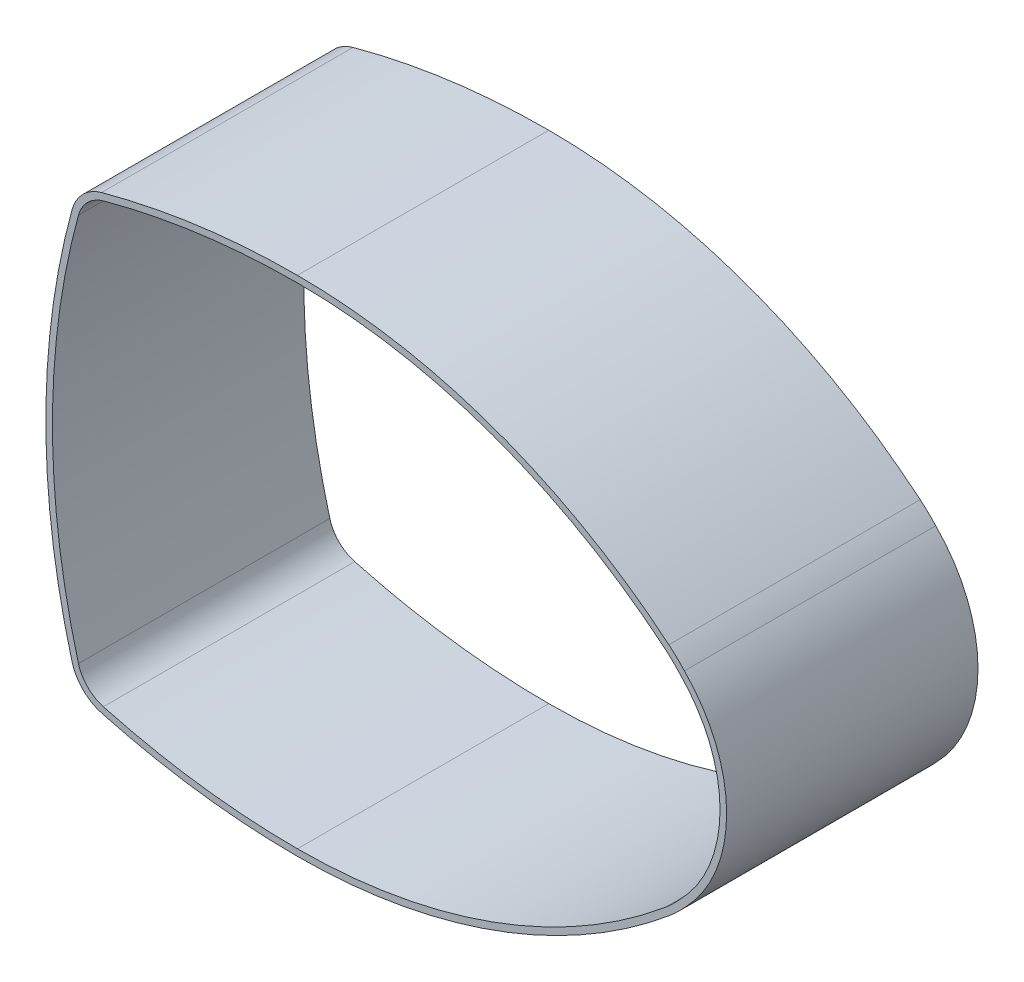
ISO-10303-21;
HEADER;
FILE_DESCRIPTION(('STEP AP214'),'2;1');
FILE_NAME('part.step','',(''),(''),'','','');
FILE_SCHEMA(('AUTOMOTIVE_DESIGN { 1 0 10303 214 1 1 1 1 }'));
ENDSEC;
DATA;
#1=APPLICATION_CONTEXT('core data for automotive mechanical design processes');
#2=APPLICATION_PROTOCOL_DEFINITION('international standard','automotive_design',2000,#1);
#3=PRODUCT_CONTEXT('',#1,'mechanical');
#4=PRODUCT('Part','Part','',(#3));
#5=PRODUCT_RELATED_PRODUCT_CATEGORY('part','',(#4));
#6=PRODUCT_DEFINITION_FORMATION('','',#4);
#7=PRODUCT_DEFINITION_CONTEXT('part definition',#1,'design');
#8=PRODUCT_DEFINITION('design','',#6,#7);
#9=PRODUCT_DEFINITION_SHAPE('','',#8);
#10=(LENGTH_UNIT() NAMED_UNIT(*) SI_UNIT(.MILLI.,.METRE.));
#11=(NAMED_UNIT(*) PLANE_ANGLE_UNIT() SI_UNIT($,.RADIAN.));
#12=(NAMED_UNIT(*) SI_UNIT($,.STERADIAN.) SOLID_ANGLE_UNIT());
#13=UNCERTAINTY_MEASURE_WITH_UNIT(LENGTH_MEASURE(1.E-05),#10,'distance_accuracy_value','');
#14=(GEOMETRIC_REPRESENTATION_CONTEXT(3) GLOBAL_UNCERTAINTY_ASSIGNED_CONTEXT((#13)) GLOBAL_UNIT_ASSIGNED_CONTEXT((#10,
#11,#12)) REPRESENTATION_CONTEXT('',''));
#15=CARTESIAN_POINT('',(0.,0.,0.));
#16=DIRECTION('',(0.,0.,1.));
#17=DIRECTION('',(1.,0.,0.));
#18=AXIS2_PLACEMENT_3D('',#15,#16,#17);
#19=CARTESIAN_POINT('',(41.6420544105904,62.4105109617289,38.1));
#20=DIRECTION('',(0.,0.,-1.));
#21=DIRECTION('',(-1.,0.,0.));
#22=AXIS2_PLACEMENT_3D('',#19,#20,#21);
#23=PLANE('',#22);
#24=CARTESIAN_POINT('',(42.3953400625025,62.410510974871,38.1));
#25=DIRECTION('',(0.,0.,1.));
#26=DIRECTION('',(-1.,0.,0.));
#27=AXIS2_PLACEMENT_3D('',#24,#25,#26);
#28=CIRCLE('',#27,22.0469690110161);
#29=CARTESIAN_POINT('',(58.0391292223879,46.8753668435537,38.1));
#30=VERTEX_POINT('',#29);
#31=CARTESIAN_POINT('',(58.0391292242888,77.9456551079096,38.1));
#32=VERTEX_POINT('',#31);
#33=EDGE_CURVE('E255',#30,#32,#28,.T.);
#34=ORIENTED_EDGE('',*,*,#33,.T.);
#35=CARTESIAN_POINT('',(40.8887687586783,62.4105109485867,38.1));
#36=DIRECTION('',(0.,0.,1.));
#37=DIRECTION('',(1.,0.,0.));
#38=AXIS2_PLACEMENT_3D('',#35,#36,#37);
#39=CIRCLE('',#38,23.140345030948);
#40=CARTESIAN_POINT('',(55.6838539146788,80.2032348372445,38.1));
#41=VERTEX_POINT('',#40);
#42=EDGE_CURVE('E258',#32,#41,#39,.T.);
#43=ORIENTED_EDGE('',*,*,#42,.T.);
#44=CARTESIAN_POINT('',(-0.611231212107009,12.5021776456092,38.1));
#45=DIRECTION('',(0.,0.,1.));
#46=DIRECTION('',(1.,0.,0.));
#47=AXIS2_PLACEMENT_3D('',#44,#45,#46);
#48=CIRCLE('',#47,88.0486783222618);
#49=CARTESIAN_POINT('',(-0.611231213972652,100.550855967871,38.1));
#50=VERTEX_POINT('',#49);
#51=EDGE_CURVE('E261',#41,#50,#48,.T.);
#52=ORIENTED_EDGE('',*,*,#51,.T.);
#53=CARTESIAN_POINT('',(-0.611231219024219,-12.2478223410265,38.1));
#54=DIRECTION('',(0.,0.,1.));
#55=DIRECTION('',(1.,0.,0.));
#56=AXIS2_PLACEMENT_3D('',#53,#54,#55);
#57=CIRCLE('',#56,112.798678308898);
#58=CARTESIAN_POINT('',(-30.2927692507265,96.5756499813855,38.1));
#59=VERTEX_POINT('',#58);
#60=EDGE_CURVE('E263',#50,#59,#57,.T.);
#61=ORIENTED_EDGE('',*,*,#60,.T.);
#62=CARTESIAN_POINT('',(-28.6112312120414,90.4105109728702,38.1));
#63=DIRECTION('',(0.,0.,1.));
#64=DIRECTION('',(1.,0.,0.));
#65=AXIS2_PLACEMENT_3D('',#62,#63,#64);
#66=CIRCLE('',#65,6.39034499615337);
#67=CARTESIAN_POINT('',(-34.7763702207224,92.0920490109478,38.1));
#68=VERTEX_POINT('',#67);
#69=EDGE_CURVE('E265',#59,#68,#66,.T.);
#70=ORIENTED_EDGE('',*,*,#69,.T.);
#71=CARTESIAN_POINT('',(74.0471021245286,62.4105109748711,38.1));
#72=DIRECTION('',(0.,0.,1.));
#73=DIRECTION('',(1.,0.,0.));
#74=AXIS2_PLACEMENT_3D('',#71,#72,#73);
#75=CIRCLE('',#74,112.798678332083);
#76=CARTESIAN_POINT('',(-34.7763702205594,32.7289729381969,38.1));
#77=VERTEX_POINT('',#76);
#78=EDGE_CURVE('E267',#68,#77,#75,.T.);
#79=ORIENTED_EDGE('',*,*,#78,.T.);
#80=CARTESIAN_POINT('',(-28.6112312120415,34.4105109768718,38.1));
#81=DIRECTION('',(0.,0.,1.));
#82=DIRECTION('',(1.,0.,0.));
#83=AXIS2_PLACEMENT_3D('',#80,#81,#82);
#84=CIRCLE('',#83,6.39034499615321);
#85=CARTESIAN_POINT('',(-30.2927692501432,28.2453719681975,38.1));
#86=VERTEX_POINT('',#85);
#87=EDGE_CURVE('E269',#77,#86,#84,.T.);
#88=ORIENTED_EDGE('',*,*,#87,.T.);
#89=CARTESIAN_POINT('',(-0.611231219025108,137.068844290764,38.1));
#90=DIRECTION('',(0.,0.,1.));
#91=DIRECTION('',(1.,0.,0.));
#92=AXIS2_PLACEMENT_3D('',#89,#90,#91);
#93=CIRCLE('',#92,112.798678308893);
#94=CARTESIAN_POINT('',(-0.611231214043513,24.2701659818711,38.1));
#95=VERTEX_POINT('',#94);
#96=EDGE_CURVE('E271',#86,#95,#93,.T.);
#97=ORIENTED_EDGE('',*,*,#96,.T.);
#98=CARTESIAN_POINT('',(-0.61123121210712,112.318844304133,38.1));
#99=DIRECTION('',(0.,0.,1.));
#100=DIRECTION('',(1.,0.,0.));
#101=AXIS2_PLACEMENT_3D('',#98,#99,#100);
#102=CIRCLE('',#101,88.0486783222617);
#103=CARTESIAN_POINT('',(55.6838539148431,44.6177871126343,38.1));
#104=VERTEX_POINT('',#103);
#105=EDGE_CURVE('E273',#95,#104,#102,.T.);
#106=ORIENTED_EDGE('',*,*,#105,.T.);
#107=CARTESIAN_POINT('',(40.8887687586783,62.4105109485867,38.1));
#108=DIRECTION('',(0.,0.,1.));
#109=DIRECTION('',(1.,0.,0.));
#110=AXIS2_PLACEMENT_3D('',#107,#108,#109);
#111=CIRCLE('',#110,23.140344993092);
#112=EDGE_CURVE('E275',#104,#30,#111,.T.);
#113=ORIENTED_EDGE('',*,*,#112,.T.);
#114=EDGE_LOOP('',(#34,#43,#52,#61,#70,#79,#88,#97,#106,#113));
#115=FACE_BOUND('',#114,.T.);
#116=CARTESIAN_POINT('',(40.8887687586783,62.4105109485867,38.1));
#117=DIRECTION('',(0.,0.,1.));
#118=DIRECTION('',(1.,0.,0.));
#119=AXIS2_PLACEMENT_3D('',#116,#117,#118);
#120=CIRCLE('',#119,22.140345030948);
#121=CARTESIAN_POINT('',(57.3133912528674,77.2572834602405,38.1));
#122=VERTEX_POINT('',#121);
#123=CARTESIAN_POINT('',(55.0444907100155,79.4343299715279,38.1));
#124=VERTEX_POINT('',#123);
#125=EDGE_CURVE('E176',#122,#124,#120,.T.);
#126=ORIENTED_EDGE('',*,*,#125,.F.);
#127=CARTESIAN_POINT('',(42.3953400625025,62.410510974871,38.1));
#128=DIRECTION('',(0.,0.,1.));
#129=DIRECTION('',(-1.,0.,0.));
#130=AXIS2_PLACEMENT_3D('',#127,#128,#129);
#131=CIRCLE('',#130,21.0469690110161);
#132=CARTESIAN_POINT('',(57.3133912528674,47.5637384895016,38.1));
#133=VERTEX_POINT('',#132);
#134=EDGE_CURVE('E213',#133,#122,#131,.T.);
#135=ORIENTED_EDGE('',*,*,#134,.F.);
#136=CARTESIAN_POINT('',(40.8887687586792,62.4105110011545,38.1));
#137=DIRECTION('',(0.,0.,1.));
#138=DIRECTION('',(1.,0.,0.));
#139=AXIS2_PLACEMENT_3D('',#136,#137,#138);
#140=CIRCLE('',#139,22.1403450309467);
#141=CARTESIAN_POINT('',(55.044490710311,45.3866919784599,38.1));
#142=VERTEX_POINT('',#141);
#143=EDGE_CURVE('E211',#142,#133,#140,.T.);
#144=ORIENTED_EDGE('',*,*,#143,.F.);
#145=CARTESIAN_POINT('',(-0.61123121210712,112.318844304133,38.1));
#146=DIRECTION('',(0.,0.,1.));
#147=DIRECTION('',(1.,0.,0.));
#148=AXIS2_PLACEMENT_3D('',#145,#146,#147);
#149=CIRCLE('',#148,87.0486783222617);
#150=CARTESIAN_POINT('',(-0.611231214087708,25.270165981871,38.1));
#151=VERTEX_POINT('',#150);
#152=EDGE_CURVE('E209',#151,#142,#149,.T.);
#153=ORIENTED_EDGE('',*,*,#152,.F.);
#154=CARTESIAN_POINT('',(-0.611231219025108,137.068844290764,38.1));
#155=DIRECTION('',(0.,0.,1.));
#156=DIRECTION('',(1.,0.,0.));
#157=AXIS2_PLACEMENT_3D('',#154,#155,#156);
#158=CIRCLE('',#157,111.798678308893);
#159=CARTESIAN_POINT('',(-30.0296319642668,29.2101303673739,38.1));
#160=VERTEX_POINT('',#159);
#161=EDGE_CURVE('E207',#160,#151,#158,.T.);
#162=ORIENTED_EDGE('',*,*,#161,.F.);
#163=CARTESIAN_POINT('',(-28.6112312120415,34.4105109768718,38.1));
#164=DIRECTION('',(0.,0.,1.));
#165=DIRECTION('',(1.,0.,0.));
#166=AXIS2_PLACEMENT_3D('',#163,#164,#165);
#167=CIRCLE('',#166,5.3903449961532);
#168=CARTESIAN_POINT('',(-33.8116118213102,32.9921102238066,38.1));
#169=VERTEX_POINT('',#168);
#170=EDGE_CURVE('E205',#169,#160,#167,.T.);
#171=ORIENTED_EDGE('',*,*,#170,.F.);
#172=CARTESIAN_POINT('',(74.0471021245286,62.4105109748711,38.1));
#173=DIRECTION('',(0.,0.,1.));
#174=DIRECTION('',(1.,0.,0.));
#175=AXIS2_PLACEMENT_3D('',#172,#173,#174);
#176=CIRCLE('',#175,111.798678332083);
#177=CARTESIAN_POINT('',(-33.8116118215449,91.8289117250752,38.1));
#178=VERTEX_POINT('',#177);
#179=EDGE_CURVE('E203',#178,#169,#176,.T.);
#180=ORIENTED_EDGE('',*,*,#179,.F.);
#181=CARTESIAN_POINT('',(-28.6112312120414,90.4105109728702,38.1));
#182=DIRECTION('',(0.,0.,1.));
#183=DIRECTION('',(1.,0.,0.));
#184=AXIS2_PLACEMENT_3D('',#181,#182,#183);
#185=CIRCLE('',#184,5.39034499615338);
#186=CARTESIAN_POINT('',(-30.0296319651067,95.610891582139,38.1));
#187=VERTEX_POINT('',#186);
#188=EDGE_CURVE('E199',#187,#178,#185,.T.);
#189=ORIENTED_EDGE('',*,*,#188,.F.);
#190=CARTESIAN_POINT('',(-0.611231219024219,-12.2478223410265,38.1));
#191=DIRECTION('',(0.,0.,1.));
#192=DIRECTION('',(1.,0.,0.));
#193=AXIS2_PLACEMENT_3D('',#190,#191,#192);
#194=CIRCLE('',#193,111.798678308898);
#195=CARTESIAN_POINT('',(-0.611231213951467,99.5508559678711,38.1));
#196=VERTEX_POINT('',#195);
#197=EDGE_CURVE('E197',#196,#187,#194,.T.);
#198=ORIENTED_EDGE('',*,*,#197,.F.);
#199=CARTESIAN_POINT('',(-0.611231212107009,12.5021776456092,38.1));
#200=DIRECTION('',(0.,0.,1.));
#201=DIRECTION('',(1.,0.,0.));
#202=AXIS2_PLACEMENT_3D('',#199,#200,#201);
#203=CIRCLE('',#202,87.0486783222618);
#204=EDGE_CURVE('E184',#124,#196,#203,.T.);
#205=ORIENTED_EDGE('',*,*,#204,.F.);
#206=EDGE_LOOP('',(#126,#135,#144,#153,#162,#171,#180,#189,#198,#205));
#207=FACE_BOUND('',#206,.T.);
#208=ADVANCED_FACE('F39',(#115,#207),#23,.F.);
#209=CARTESIAN_POINT('',(41.6420544105904,62.4105109617289,0.));
#210=DIRECTION('',(0.,0.,-1.));
#211=DIRECTION('',(-1.,0.,0.));
#212=AXIS2_PLACEMENT_3D('',#209,#210,#211);
#213=PLANE('',#212);
#214=CARTESIAN_POINT('',(42.3953400625025,62.410510974871,0.));
#215=DIRECTION('',(0.,0.,1.));
#216=DIRECTION('',(-1.,0.,0.));
#217=AXIS2_PLACEMENT_3D('',#214,#215,#216);
#218=CIRCLE('',#217,22.0469690110161);
#219=CARTESIAN_POINT('',(58.0391292223879,46.8753668435537,0.));
#220=VERTEX_POINT('',#219);
#221=CARTESIAN_POINT('',(58.0391292242888,77.9456551079096,0.));
#222=VERTEX_POINT('',#221);
#223=EDGE_CURVE('E192',#220,#222,#218,.T.);
#224=ORIENTED_EDGE('',*,*,#223,.F.);
#225=CARTESIAN_POINT('',(40.8887687586783,62.4105109485867,0.));
#226=DIRECTION('',(0.,0.,1.));
#227=DIRECTION('',(1.,0.,0.));
#228=AXIS2_PLACEMENT_3D('',#225,#226,#227);
#229=CIRCLE('',#228,23.140344993092);
#230=CARTESIAN_POINT('',(55.6838539148431,44.6177871126343,0.));
#231=VERTEX_POINT('',#230);
#232=EDGE_CURVE('E259',#231,#220,#229,.T.);
#233=ORIENTED_EDGE('',*,*,#232,.F.);
#234=CARTESIAN_POINT('',(-0.61123121210712,112.318844304133,0.));
#235=DIRECTION('',(0.,0.,1.));
#236=DIRECTION('',(1.,0.,0.));
#237=AXIS2_PLACEMENT_3D('',#234,#235,#236);
#238=CIRCLE('',#237,88.0486783222617);
#239=CARTESIAN_POINT('',(-0.611231214043513,24.2701659818711,0.));
#240=VERTEX_POINT('',#239);
#241=EDGE_CURVE('E294',#240,#231,#238,.T.);
#242=ORIENTED_EDGE('',*,*,#241,.F.);
#243=CARTESIAN_POINT('',(-0.611231219025108,137.068844290764,0.));
#244=DIRECTION('',(0.,0.,1.));
#245=DIRECTION('',(1.,0.,0.));
#246=AXIS2_PLACEMENT_3D('',#243,#244,#245);
#247=CIRCLE('',#246,112.798678308893);
#248=CARTESIAN_POINT('',(-30.2927692501432,28.2453719681975,0.));
#249=VERTEX_POINT('',#248);
#250=EDGE_CURVE('E292',#249,#240,#247,.T.);
#251=ORIENTED_EDGE('',*,*,#250,.F.);
#252=CARTESIAN_POINT('',(-28.6112312120415,34.4105109768718,0.));
#253=DIRECTION('',(0.,0.,1.));
#254=DIRECTION('',(1.,0.,0.));
#255=AXIS2_PLACEMENT_3D('',#252,#253,#254);
#256=CIRCLE('',#255,6.39034499615321);
#257=CARTESIAN_POINT('',(-34.7763702205594,32.7289729381969,0.));
#258=VERTEX_POINT('',#257);
#259=EDGE_CURVE('E290',#258,#249,#256,.T.);
#260=ORIENTED_EDGE('',*,*,#259,.F.);
#261=CARTESIAN_POINT('',(74.0471021245286,62.4105109748711,0.));
#262=DIRECTION('',(0.,0.,1.));
#263=DIRECTION('',(1.,0.,0.));
#264=AXIS2_PLACEMENT_3D('',#261,#262,#263);
#265=CIRCLE('',#264,112.798678332083);
#266=CARTESIAN_POINT('',(-34.7763702207224,92.0920490109478,0.));
#267=VERTEX_POINT('',#266);
#268=EDGE_CURVE('E288',#267,#258,#265,.T.);
#269=ORIENTED_EDGE('',*,*,#268,.F.);
#270=CARTESIAN_POINT('',(-28.6112312120414,90.4105109728702,0.));
#271=DIRECTION('',(0.,0.,1.));
#272=DIRECTION('',(1.,0.,0.));
#273=AXIS2_PLACEMENT_3D('',#270,#271,#272);
#274=CIRCLE('',#273,6.39034499615337);
#275=CARTESIAN_POINT('',(-30.2927692507265,96.5756499813855,0.));
#276=VERTEX_POINT('',#275);
#277=EDGE_CURVE('E286',#276,#267,#274,.T.);
#278=ORIENTED_EDGE('',*,*,#277,.F.);
#279=CARTESIAN_POINT('',(-0.611231219024219,-12.2478223410265,0.));
#280=DIRECTION('',(0.,0.,1.));
#281=DIRECTION('',(1.,0.,0.));
#282=AXIS2_PLACEMENT_3D('',#279,#280,#281);
#283=CIRCLE('',#282,112.798678308898);
#284=CARTESIAN_POINT('',(-0.611231213972652,100.550855967871,0.));
#285=VERTEX_POINT('',#284);
#286=EDGE_CURVE('E284',#285,#276,#283,.T.);
#287=ORIENTED_EDGE('',*,*,#286,.F.);
#288=CARTESIAN_POINT('',(-0.611231212107009,12.5021776456092,0.));
#289=DIRECTION('',(0.,0.,1.));
#290=DIRECTION('',(1.,0.,0.));
#291=AXIS2_PLACEMENT_3D('',#288,#289,#290);
#292=CIRCLE('',#291,88.0486783222618);
#293=CARTESIAN_POINT('',(55.6838539146788,80.2032348372445,0.));
#294=VERTEX_POINT('',#293);
#295=EDGE_CURVE('E282',#294,#285,#292,.T.);
#296=ORIENTED_EDGE('',*,*,#295,.F.);
#297=CARTESIAN_POINT('',(40.8887687586783,62.4105109485867,0.));
#298=DIRECTION('',(0.,0.,1.));
#299=DIRECTION('',(1.,0.,0.));
#300=AXIS2_PLACEMENT_3D('',#297,#298,#299);
#301=CIRCLE('',#300,23.140345030948);
#302=EDGE_CURVE('E280',#222,#294,#301,.T.);
#303=ORIENTED_EDGE('',*,*,#302,.F.);
#304=EDGE_LOOP('',(#224,#233,#242,#251,#260,#269,#278,#287,#296,#303));
#305=FACE_BOUND('',#304,.T.);
#306=CARTESIAN_POINT('',(42.3953400625025,62.410510974871,0.));
#307=DIRECTION('',(0.,0.,1.));
#308=DIRECTION('',(-1.,0.,0.));
#309=AXIS2_PLACEMENT_3D('',#306,#307,#308);
#310=CIRCLE('',#309,21.0469690110161);
#311=CARTESIAN_POINT('',(57.3133912528674,47.5637384895016,0.));
#312=VERTEX_POINT('',#311);
#313=CARTESIAN_POINT('',(57.3133912528674,77.2572834602405,0.));
#314=VERTEX_POINT('',#313);
#315=EDGE_CURVE('E185',#312,#314,#310,.T.);
#316=ORIENTED_EDGE('',*,*,#315,.T.);
#317=CARTESIAN_POINT('',(40.8887687586783,62.4105109485867,0.));
#318=DIRECTION('',(0.,0.,1.));
#319=DIRECTION('',(1.,0.,0.));
#320=AXIS2_PLACEMENT_3D('',#317,#318,#319);
#321=CIRCLE('',#320,22.140345030948);
#322=CARTESIAN_POINT('',(55.0444907100155,79.4343299715279,0.));
#323=VERTEX_POINT('',#322);
#324=EDGE_CURVE('E62',#314,#323,#321,.T.);
#325=ORIENTED_EDGE('',*,*,#324,.T.);
#326=CARTESIAN_POINT('',(-0.611231212107009,12.5021776456092,0.));
#327=DIRECTION('',(0.,0.,1.));
#328=DIRECTION('',(1.,0.,0.));
#329=AXIS2_PLACEMENT_3D('',#326,#327,#328);
#330=CIRCLE('',#329,87.0486783222618);
#331=CARTESIAN_POINT('',(-0.611231213951467,99.5508559678711,0.));
#332=VERTEX_POINT('',#331);
#333=EDGE_CURVE('E191',#323,#332,#330,.T.);
#334=ORIENTED_EDGE('',*,*,#333,.T.);
#335=CARTESIAN_POINT('',(-0.611231219024219,-12.2478223410265,0.));
#336=DIRECTION('',(0.,0.,1.));
#337=DIRECTION('',(1.,0.,0.));
#338=AXIS2_PLACEMENT_3D('',#335,#336,#337);
#339=CIRCLE('',#338,111.798678308898);
#340=CARTESIAN_POINT('',(-30.0296319651067,95.610891582139,0.));
#341=VERTEX_POINT('',#340);
#342=EDGE_CURVE('E217',#332,#341,#339,.T.);
#343=ORIENTED_EDGE('',*,*,#342,.T.);
#344=CARTESIAN_POINT('',(-28.6112312120414,90.4105109728702,0.));
#345=DIRECTION('',(0.,0.,1.));
#346=DIRECTION('',(1.,0.,0.));
#347=AXIS2_PLACEMENT_3D('',#344,#345,#346);
#348=CIRCLE('',#347,5.39034499615338);
#349=CARTESIAN_POINT('',(-33.8116118215449,91.8289117250752,0.));
#350=VERTEX_POINT('',#349);
#351=EDGE_CURVE('E220',#341,#350,#348,.T.);
#352=ORIENTED_EDGE('',*,*,#351,.T.);
#353=CARTESIAN_POINT('',(74.0471021245286,62.4105109748711,0.));
#354=DIRECTION('',(0.,0.,1.));
#355=DIRECTION('',(1.,0.,0.));
#356=AXIS2_PLACEMENT_3D('',#353,#354,#355);
#357=CIRCLE('',#356,111.798678332083);
#358=CARTESIAN_POINT('',(-33.8116118213102,32.9921102238066,0.));
#359=VERTEX_POINT('',#358);
#360=EDGE_CURVE('E223',#350,#359,#357,.T.);
#361=ORIENTED_EDGE('',*,*,#360,.T.);
#362=CARTESIAN_POINT('',(-28.6112312120415,34.4105109768718,0.));
#363=DIRECTION('',(0.,0.,1.));
#364=DIRECTION('',(1.,0.,0.));
#365=AXIS2_PLACEMENT_3D('',#362,#363,#364);
#366=CIRCLE('',#365,5.3903449961532);
#367=CARTESIAN_POINT('',(-30.0296319642668,29.2101303673739,0.));
#368=VERTEX_POINT('',#367);
#369=EDGE_CURVE('E226',#359,#368,#366,.T.);
#370=ORIENTED_EDGE('',*,*,#369,.T.);
#371=CARTESIAN_POINT('',(-0.611231219025108,137.068844290764,0.));
#372=DIRECTION('',(0.,0.,1.));
#373=DIRECTION('',(1.,0.,0.));
#374=AXIS2_PLACEMENT_3D('',#371,#372,#373);
#375=CIRCLE('',#374,111.798678308893);
#376=CARTESIAN_POINT('',(-0.611231214087708,25.270165981871,0.));
#377=VERTEX_POINT('',#376);
#378=EDGE_CURVE('E229',#368,#377,#375,.T.);
#379=ORIENTED_EDGE('',*,*,#378,.T.);
#380=CARTESIAN_POINT('',(-0.61123121210712,112.318844304133,0.));
#381=DIRECTION('',(0.,0.,1.));
#382=DIRECTION('',(1.,0.,0.));
#383=AXIS2_PLACEMENT_3D('',#380,#381,#382);
#384=CIRCLE('',#383,87.0486783222617);
#385=CARTESIAN_POINT('',(55.044490710311,45.3866919784599,0.));
#386=VERTEX_POINT('',#385);
#387=EDGE_CURVE('E232',#377,#386,#384,.T.);
#388=ORIENTED_EDGE('',*,*,#387,.T.);
#389=CARTESIAN_POINT('',(40.8887687586792,62.4105110011545,0.));
#390=DIRECTION('',(0.,0.,1.));
#391=DIRECTION('',(1.,0.,0.));
#392=AXIS2_PLACEMENT_3D('',#389,#390,#391);
#393=CIRCLE('',#392,22.1403450309467);
#394=EDGE_CURVE('E235',#386,#312,#393,.T.);
#395=ORIENTED_EDGE('',*,*,#394,.T.);
#396=EDGE_LOOP('',(#316,#325,#334,#343,#352,#361,#370,#379,#388,#395));
#397=FACE_BOUND('',#396,.T.);
#398=ADVANCED_FACE('F330',(#305,#397),#213,.T.);
#399=CARTESIAN_POINT('',(42.3953400625025,62.410510974871,38.1));
#400=DIRECTION('',(0.,0.,-1.));
#401=DIRECTION('',(-1.,0.,0.));
#402=AXIS2_PLACEMENT_3D('',#399,#400,#401);
#403=CYLINDRICAL_SURFACE('',#402,22.0469690110161);
#404=ORIENTED_EDGE('',*,*,#223,.T.);
#405=DIRECTION('',(0.,0.,-1.));
#406=VECTOR('',#405,1.);
#407=CARTESIAN_POINT('',(58.0391292242888,77.9456551079096,38.1));
#408=LINE('',#407,#406);
#409=EDGE_CURVE('E11',#32,#222,#408,.T.);
#410=ORIENTED_EDGE('',*,*,#409,.F.);
#411=ORIENTED_EDGE('',*,*,#33,.F.);
#412=DIRECTION('',(0.,0.,-1.));
#413=VECTOR('',#412,1.);
#414=CARTESIAN_POINT('',(58.0391292223879,46.8753668435537,38.1));
#415=LINE('',#414,#413);
#416=EDGE_CURVE('E277',#30,#220,#415,.T.);
#417=ORIENTED_EDGE('',*,*,#416,.T.);
#418=EDGE_LOOP('',(#404,#410,#411,#417));
#419=FACE_BOUND('',#418,.T.);
#420=ADVANCED_FACE('F41',(#419),#403,.T.);
#421=CARTESIAN_POINT('',(40.8887687586783,62.4105109485867,38.1));
#422=DIRECTION('',(0.,0.,-1.));
#423=DIRECTION('',(-1.,0.,0.));
#424=AXIS2_PLACEMENT_3D('',#421,#422,#423);
#425=CYLINDRICAL_SURFACE('',#424,23.140345030948);
#426=ORIENTED_EDGE('',*,*,#302,.T.);
#427=DIRECTION('',(0.,0.,-1.));
#428=VECTOR('',#427,1.);
#429=CARTESIAN_POINT('',(55.6838539146788,80.2032348372445,38.1));
#430=LINE('',#429,#428);
#431=EDGE_CURVE('E47',#41,#294,#430,.T.);
#432=ORIENTED_EDGE('',*,*,#431,.F.);
#433=ORIENTED_EDGE('',*,*,#42,.F.);
#434=ORIENTED_EDGE('',*,*,#409,.T.);
#435=EDGE_LOOP('',(#426,#432,#433,#434));
#436=FACE_BOUND('',#435,.T.);
#437=ADVANCED_FACE('F347',(#436),#425,.T.);
#438=CARTESIAN_POINT('',(-0.611231212107009,12.5021776456092,38.1));
#439=DIRECTION('',(0.,0.,-1.));
#440=DIRECTION('',(-1.,0.,0.));
#441=AXIS2_PLACEMENT_3D('',#438,#439,#440);
#442=CYLINDRICAL_SURFACE('',#441,88.0486783222618);
#443=ORIENTED_EDGE('',*,*,#295,.T.);
#444=DIRECTION('',(0.,0.,-1.));
#445=VECTOR('',#444,1.);
#446=CARTESIAN_POINT('',(-0.611231213972652,100.550855967871,38.1));
#447=LINE('',#446,#445);
#448=EDGE_CURVE('E317',#50,#285,#447,.T.);
#449=ORIENTED_EDGE('',*,*,#448,.F.);
#450=ORIENTED_EDGE('',*,*,#51,.F.);
#451=ORIENTED_EDGE('',*,*,#431,.T.);
#452=EDGE_LOOP('',(#443,#449,#450,#451));
#453=FACE_BOUND('',#452,.T.);
#454=ADVANCED_FACE('F324',(#453),#442,.T.);
#455=CARTESIAN_POINT('',(-0.611231219024219,-12.2478223410265,38.1));
#456=DIRECTION('',(0.,0.,-1.));
#457=DIRECTION('',(-1.,0.,0.));
#458=AXIS2_PLACEMENT_3D('',#455,#456,#457);
#459=CYLINDRICAL_SURFACE('',#458,112.798678308898);
#460=ORIENTED_EDGE('',*,*,#286,.T.);
#461=DIRECTION('',(0.,0.,-1.));
#462=VECTOR('',#461,1.);
#463=CARTESIAN_POINT('',(-30.2927692507265,96.5756499813855,38.1));
#464=LINE('',#463,#462);
#465=EDGE_CURVE('E314',#59,#276,#464,.T.);
#466=ORIENTED_EDGE('',*,*,#465,.F.);
#467=ORIENTED_EDGE('',*,*,#60,.F.);
#468=ORIENTED_EDGE('',*,*,#448,.T.);
#469=EDGE_LOOP('',(#460,#466,#467,#468));
#470=FACE_BOUND('',#469,.T.);
#471=ADVANCED_FACE('F336',(#470),#459,.T.);
#472=CARTESIAN_POINT('',(-28.6112312120414,90.4105109728702,38.1));
#473=DIRECTION('',(0.,0.,-1.));
#474=DIRECTION('',(-1.,0.,0.));
#475=AXIS2_PLACEMENT_3D('',#472,#473,#474);
#476=CYLINDRICAL_SURFACE('',#475,6.39034499615337);
#477=ORIENTED_EDGE('',*,*,#277,.T.);
#478=DIRECTION('',(0.,0.,-1.));
#479=VECTOR('',#478,1.);
#480=CARTESIAN_POINT('',(-34.7763702207224,92.0920490109478,38.1));
#481=LINE('',#480,#479);
#482=EDGE_CURVE('E311',#68,#267,#481,.T.);
#483=ORIENTED_EDGE('',*,*,#482,.F.);
#484=ORIENTED_EDGE('',*,*,#69,.F.);
#485=ORIENTED_EDGE('',*,*,#465,.T.);
#486=EDGE_LOOP('',(#477,#483,#484,#485));
#487=FACE_BOUND('',#486,.T.);
#488=ADVANCED_FACE('F340',(#487),#476,.T.);
#489=CARTESIAN_POINT('',(74.0471021245286,62.4105109748711,38.1));
#490=DIRECTION('',(0.,0.,-1.));
#491=DIRECTION('',(-1.,0.,0.));
#492=AXIS2_PLACEMENT_3D('',#489,#490,#491);
#493=CYLINDRICAL_SURFACE('',#492,112.798678332083);
#494=ORIENTED_EDGE('',*,*,#268,.T.);
#495=DIRECTION('',(0.,0.,-1.));
#496=VECTOR('',#495,1.);
#497=CARTESIAN_POINT('',(-34.7763702205594,32.7289729381969,38.1));
#498=LINE('',#497,#496);
#499=EDGE_CURVE('E308',#77,#258,#498,.T.);
#500=ORIENTED_EDGE('',*,*,#499,.F.);
#501=ORIENTED_EDGE('',*,*,#78,.F.);
#502=ORIENTED_EDGE('',*,*,#482,.T.);
#503=EDGE_LOOP('',(#494,#500,#501,#502));
#504=FACE_BOUND('',#503,.T.);
#505=ADVANCED_FACE('F370',(#504),#493,.T.);
#506=CARTESIAN_POINT('',(-28.6112312120415,34.4105109768718,38.1));
#507=DIRECTION('',(0.,0.,-1.));
#508=DIRECTION('',(-1.,0.,0.));
#509=AXIS2_PLACEMENT_3D('',#506,#507,#508);
#510=CYLINDRICAL_SURFACE('',#509,6.39034499615321);
#511=ORIENTED_EDGE('',*,*,#259,.T.);
#512=DIRECTION('',(0.,0.,-1.));
#513=VECTOR('',#512,1.);
#514=CARTESIAN_POINT('',(-30.2927692501432,28.2453719681975,38.1));
#515=LINE('',#514,#513);
#516=EDGE_CURVE('E305',#86,#249,#515,.T.);
#517=ORIENTED_EDGE('',*,*,#516,.F.);
#518=ORIENTED_EDGE('',*,*,#87,.F.);
#519=ORIENTED_EDGE('',*,*,#499,.T.);
#520=EDGE_LOOP('',(#511,#517,#518,#519));
#521=FACE_BOUND('',#520,.T.);
#522=ADVANCED_FACE('F367',(#521),#510,.T.);
#523=CARTESIAN_POINT('',(-0.611231219025108,137.068844290764,38.1));
#524=DIRECTION('',(0.,0.,-1.));
#525=DIRECTION('',(-1.,0.,0.));
#526=AXIS2_PLACEMENT_3D('',#523,#524,#525);
#527=CYLINDRICAL_SURFACE('',#526,112.798678308893);
#528=ORIENTED_EDGE('',*,*,#250,.T.);
#529=DIRECTION('',(0.,0.,-1.));
#530=VECTOR('',#529,1.);
#531=CARTESIAN_POINT('',(-0.611231214043513,24.2701659818711,38.1));
#532=LINE('',#531,#530);
#533=EDGE_CURVE('E302',#95,#240,#532,.T.);
#534=ORIENTED_EDGE('',*,*,#533,.F.);
#535=ORIENTED_EDGE('',*,*,#96,.F.);
#536=ORIENTED_EDGE('',*,*,#516,.T.);
#537=EDGE_LOOP('',(#528,#534,#535,#536));
#538=FACE_BOUND('',#537,.T.);
#539=ADVANCED_FACE('F363',(#538),#527,.T.);
#540=CARTESIAN_POINT('',(-0.61123121210712,112.318844304133,38.1));
#541=DIRECTION('',(0.,0.,-1.));
#542=DIRECTION('',(-1.,0.,0.));
#543=AXIS2_PLACEMENT_3D('',#540,#541,#542);
#544=CYLINDRICAL_SURFACE('',#543,88.0486783222617);
#545=ORIENTED_EDGE('',*,*,#241,.T.);
#546=DIRECTION('',(0.,0.,-1.));
#547=VECTOR('',#546,1.);
#548=CARTESIAN_POINT('',(55.6838539148431,44.6177871126343,38.1));
#549=LINE('',#548,#547);
#550=EDGE_CURVE('E299',#104,#231,#549,.T.);
#551=ORIENTED_EDGE('',*,*,#550,.F.);
#552=ORIENTED_EDGE('',*,*,#105,.F.);
#553=ORIENTED_EDGE('',*,*,#533,.T.);
#554=EDGE_LOOP('',(#545,#551,#552,#553));
#555=FACE_BOUND('',#554,.T.);
#556=ADVANCED_FACE('F359',(#555),#544,.T.);
#557=CARTESIAN_POINT('',(40.8887687586783,62.4105109485867,38.1));
#558=DIRECTION('',(0.,0.,-1.));
#559=DIRECTION('',(-1.,0.,0.));
#560=AXIS2_PLACEMENT_3D('',#557,#558,#559);
#561=CYLINDRICAL_SURFACE('',#560,23.140344993092);
#562=ORIENTED_EDGE('',*,*,#232,.T.);
#563=ORIENTED_EDGE('',*,*,#416,.F.);
#564=ORIENTED_EDGE('',*,*,#112,.F.);
#565=ORIENTED_EDGE('',*,*,#550,.T.);
#566=EDGE_LOOP('',(#562,#563,#564,#565));
#567=FACE_BOUND('',#566,.T.);
#568=ADVANCED_FACE('F354',(#567),#561,.T.);
#569=CARTESIAN_POINT('',(40.8887687586783,62.4105109485867,38.1));
#570=DIRECTION('',(0.,0.,-1.));
#571=DIRECTION('',(-1.,0.,0.));
#572=AXIS2_PLACEMENT_3D('',#569,#570,#571);
#573=CYLINDRICAL_SURFACE('',#572,22.140345030948);
#574=ORIENTED_EDGE('',*,*,#324,.F.);
#575=DIRECTION('',(0.,0.,-1.));
#576=VECTOR('',#575,1.);
#577=CARTESIAN_POINT('',(57.3133912528674,77.2572834602405,38.1));
#578=LINE('',#577,#576);
#579=EDGE_CURVE('E180',#122,#314,#578,.T.);
#580=ORIENTED_EDGE('',*,*,#579,.F.);
#581=ORIENTED_EDGE('',*,*,#125,.T.);
#582=DIRECTION('',(0.,0.,-1.));
#583=VECTOR('',#582,1.);
#584=CARTESIAN_POINT('',(55.0444907100155,79.4343299715279,38.1));
#585=LINE('',#584,#583);
#586=EDGE_CURVE('E179',#124,#323,#585,.T.);
#587=ORIENTED_EDGE('',*,*,#586,.T.);
#588=EDGE_LOOP('',(#574,#580,#581,#587));
#589=FACE_BOUND('',#588,.T.);
#590=ADVANCED_FACE('F178',(#589),#573,.F.);
#591=CARTESIAN_POINT('',(-0.611231212107009,12.5021776456092,38.1));
#592=DIRECTION('',(0.,0.,-1.));
#593=DIRECTION('',(-1.,0.,0.));
#594=AXIS2_PLACEMENT_3D('',#591,#592,#593);
#595=CYLINDRICAL_SURFACE('',#594,87.0486783222618);
#596=ORIENTED_EDGE('',*,*,#333,.F.);
#597=ORIENTED_EDGE('',*,*,#586,.F.);
#598=ORIENTED_EDGE('',*,*,#204,.T.);
#599=DIRECTION('',(0.,0.,-1.));
#600=VECTOR('',#599,1.);
#601=CARTESIAN_POINT('',(-0.611231213951467,99.5508559678711,38.1));
#602=LINE('',#601,#600);
#603=EDGE_CURVE('E193',#196,#332,#602,.T.);
#604=ORIENTED_EDGE('',*,*,#603,.T.);
#605=EDGE_LOOP('',(#596,#597,#598,#604));
#606=FACE_BOUND('',#605,.T.);
#607=ADVANCED_FACE('F188',(#606),#595,.F.);
#608=CARTESIAN_POINT('',(-0.611231219024219,-12.2478223410265,38.1));
#609=DIRECTION('',(0.,0.,-1.));
#610=DIRECTION('',(-1.,0.,0.));
#611=AXIS2_PLACEMENT_3D('',#608,#609,#610);
#612=CYLINDRICAL_SURFACE('',#611,111.798678308898);
#613=ORIENTED_EDGE('',*,*,#342,.F.);
#614=ORIENTED_EDGE('',*,*,#603,.F.);
#615=ORIENTED_EDGE('',*,*,#197,.T.);
#616=DIRECTION('',(0.,0.,-1.));
#617=VECTOR('',#616,1.);
#618=CARTESIAN_POINT('',(-30.0296319651067,95.610891582139,38.1));
#619=LINE('',#618,#617);
#620=EDGE_CURVE('E252',#187,#341,#619,.T.);
#621=ORIENTED_EDGE('',*,*,#620,.T.);
#622=EDGE_LOOP('',(#613,#614,#615,#621));
#623=FACE_BOUND('',#622,.T.);
#624=ADVANCED_FACE('F416',(#623),#612,.F.);
#625=CARTESIAN_POINT('',(-28.6112312120414,90.4105109728702,38.1));
#626=DIRECTION('',(0.,0.,-1.));
#627=DIRECTION('',(-1.,0.,0.));
#628=AXIS2_PLACEMENT_3D('',#625,#626,#627);
#629=CYLINDRICAL_SURFACE('',#628,5.39034499615338);
#630=ORIENTED_EDGE('',*,*,#351,.F.);
#631=ORIENTED_EDGE('',*,*,#620,.F.);
#632=ORIENTED_EDGE('',*,*,#188,.T.);
#633=DIRECTION('',(0.,0.,-1.));
#634=VECTOR('',#633,1.);
#635=CARTESIAN_POINT('',(-33.8116118215449,91.8289117250752,38.1));
#636=LINE('',#635,#634);
#637=EDGE_CURVE('E250',#178,#350,#636,.T.);
#638=ORIENTED_EDGE('',*,*,#637,.T.);
#639=EDGE_LOOP('',(#630,#631,#632,#638));
#640=FACE_BOUND('',#639,.T.);
#641=ADVANCED_FACE('F422',(#640),#629,.F.);
#642=CARTESIAN_POINT('',(74.0471021245286,62.4105109748711,38.1));
#643=DIRECTION('',(0.,0.,-1.));
#644=DIRECTION('',(-1.,0.,0.));
#645=AXIS2_PLACEMENT_3D('',#642,#643,#644);
#646=CYLINDRICAL_SURFACE('',#645,111.798678332083);
#647=ORIENTED_EDGE('',*,*,#360,.F.);
#648=ORIENTED_EDGE('',*,*,#637,.F.);
#649=ORIENTED_EDGE('',*,*,#179,.T.);
#650=DIRECTION('',(0.,0.,-1.));
#651=VECTOR('',#650,1.);
#652=CARTESIAN_POINT('',(-33.8116118213102,32.9921102238066,38.1));
#653=LINE('',#652,#651);
#654=EDGE_CURVE('E248',#169,#359,#653,.T.);
#655=ORIENTED_EDGE('',*,*,#654,.T.);
#656=EDGE_LOOP('',(#647,#648,#649,#655));
#657=FACE_BOUND('',#656,.T.);
#658=ADVANCED_FACE('F430',(#657),#646,.F.);
#659=CARTESIAN_POINT('',(-28.6112312120415,34.4105109768718,38.1));
#660=DIRECTION('',(0.,0.,-1.));
#661=DIRECTION('',(-1.,0.,0.));
#662=AXIS2_PLACEMENT_3D('',#659,#660,#661);
#663=CYLINDRICAL_SURFACE('',#662,5.3903449961532);
#664=ORIENTED_EDGE('',*,*,#369,.F.);
#665=ORIENTED_EDGE('',*,*,#654,.F.);
#666=ORIENTED_EDGE('',*,*,#170,.T.);
#667=DIRECTION('',(0.,0.,-1.));
#668=VECTOR('',#667,1.);
#669=CARTESIAN_POINT('',(-30.0296319642668,29.2101303673739,38.1));
#670=LINE('',#669,#668);
#671=EDGE_CURVE('E246',#160,#368,#670,.T.);
#672=ORIENTED_EDGE('',*,*,#671,.T.);
#673=EDGE_LOOP('',(#664,#665,#666,#672));
#674=FACE_BOUND('',#673,.T.);
#675=ADVANCED_FACE('F438',(#674),#663,.F.);
#676=CARTESIAN_POINT('',(-0.611231219025108,137.068844290764,38.1));
#677=DIRECTION('',(0.,0.,-1.));
#678=DIRECTION('',(-1.,0.,0.));
#679=AXIS2_PLACEMENT_3D('',#676,#677,#678);
#680=CYLINDRICAL_SURFACE('',#679,111.798678308893);
#681=ORIENTED_EDGE('',*,*,#378,.F.);
#682=ORIENTED_EDGE('',*,*,#671,.F.);
#683=ORIENTED_EDGE('',*,*,#161,.T.);
#684=DIRECTION('',(0.,0.,-1.));
#685=VECTOR('',#684,1.);
#686=CARTESIAN_POINT('',(-0.611231214087708,25.270165981871,38.1));
#687=LINE('',#686,#685);
#688=EDGE_CURVE('E244',#151,#377,#687,.T.);
#689=ORIENTED_EDGE('',*,*,#688,.T.);
#690=EDGE_LOOP('',(#681,#682,#683,#689));
#691=FACE_BOUND('',#690,.T.);
#692=ADVANCED_FACE('F446',(#691),#680,.F.);
#693=CARTESIAN_POINT('',(-0.61123121210712,112.318844304133,38.1));
#694=DIRECTION('',(0.,0.,-1.));
#695=DIRECTION('',(-1.,0.,0.));
#696=AXIS2_PLACEMENT_3D('',#693,#694,#695);
#697=CYLINDRICAL_SURFACE('',#696,87.0486783222617);
#698=ORIENTED_EDGE('',*,*,#387,.F.);
#699=ORIENTED_EDGE('',*,*,#688,.F.);
#700=ORIENTED_EDGE('',*,*,#152,.T.);
#701=DIRECTION('',(0.,0.,-1.));
#702=VECTOR('',#701,1.);
#703=CARTESIAN_POINT('',(55.044490710311,45.3866919784599,38.1));
#704=LINE('',#703,#702);
#705=EDGE_CURVE('E242',#142,#386,#704,.T.);
#706=ORIENTED_EDGE('',*,*,#705,.T.);
#707=EDGE_LOOP('',(#698,#699,#700,#706));
#708=FACE_BOUND('',#707,.T.);
#709=ADVANCED_FACE('F454',(#708),#697,.F.);
#710=CARTESIAN_POINT('',(40.8887687586792,62.4105110011545,38.1));
#711=DIRECTION('',(0.,0.,-1.));
#712=DIRECTION('',(-1.,0.,0.));
#713=AXIS2_PLACEMENT_3D('',#710,#711,#712);
#714=CYLINDRICAL_SURFACE('',#713,22.1403450309467);
#715=ORIENTED_EDGE('',*,*,#394,.F.);
#716=ORIENTED_EDGE('',*,*,#705,.F.);
#717=ORIENTED_EDGE('',*,*,#143,.T.);
#718=DIRECTION('',(0.,0.,-1.));
#719=VECTOR('',#718,1.);
#720=CARTESIAN_POINT('',(57.3133912528674,47.5637384895016,38.1));
#721=LINE('',#720,#719);
#722=EDGE_CURVE('E54',#133,#312,#721,.T.);
#723=ORIENTED_EDGE('',*,*,#722,.T.);
#724=EDGE_LOOP('',(#715,#716,#717,#723));
#725=FACE_BOUND('',#724,.T.);
#726=ADVANCED_FACE('F462',(#725),#714,.F.);
#727=CARTESIAN_POINT('',(42.3953400625025,62.410510974871,38.1));
#728=DIRECTION('',(0.,0.,-1.));
#729=DIRECTION('',(-1.,0.,0.));
#730=AXIS2_PLACEMENT_3D('',#727,#728,#729);
#731=CYLINDRICAL_SURFACE('',#730,21.0469690110161);
#732=ORIENTED_EDGE('',*,*,#315,.F.);
#733=ORIENTED_EDGE('',*,*,#722,.F.);
#734=ORIENTED_EDGE('',*,*,#134,.T.);
#735=ORIENTED_EDGE('',*,*,#579,.T.);
#736=EDGE_LOOP('',(#732,#733,#734,#735));
#737=FACE_BOUND('',#736,.T.);
#738=ADVANCED_FACE('F470',(#737),#731,.F.);
#739=CLOSED_SHELL('',(#208,#398,#420,#437,#454,#471,#488,#505,#522,#539,#556,#568,#590,#607,
#624,#641,#658,#675,#692,#709,#726,#738));
#740=MANIFOLD_SOLID_BREP('B2',#739);
#741=ADVANCED_BREP_SHAPE_REPRESENTATION('',(#18,#740),#14);
#742=SHAPE_DEFINITION_REPRESENTATION(#9,#741);
ENDSEC;
END-ISO-10303-21;
